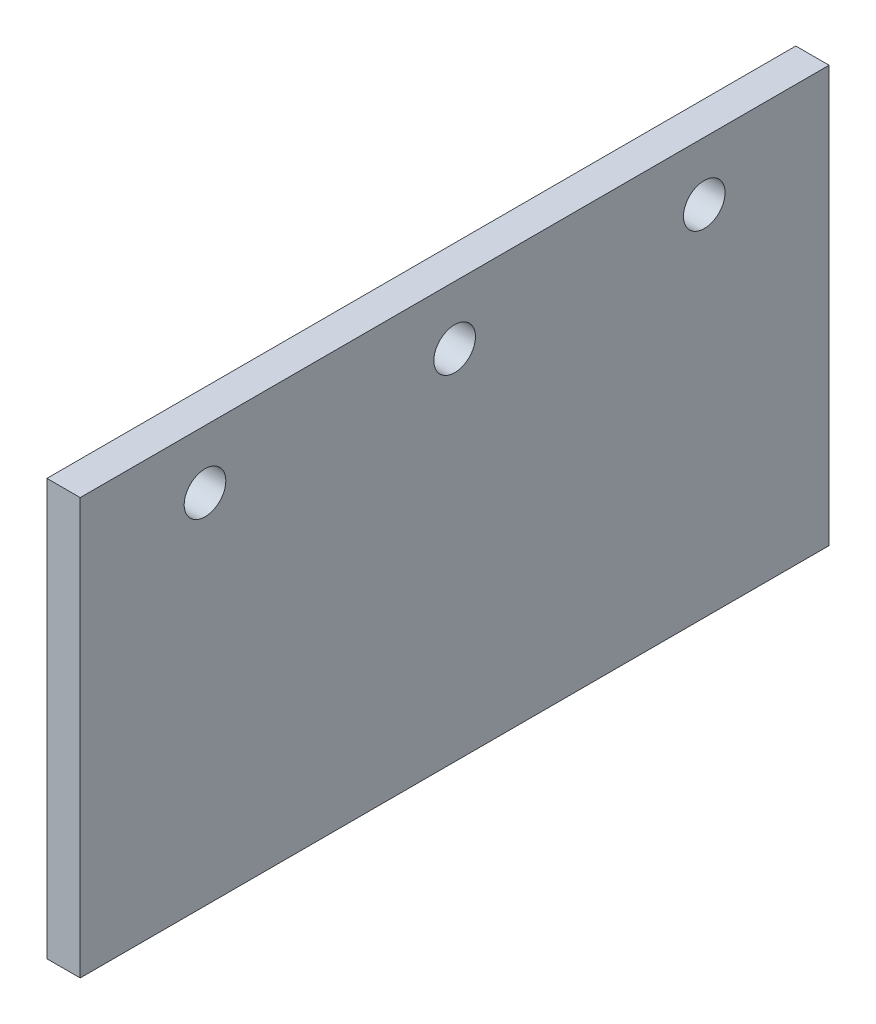
ISO-10303-21;
HEADER;
FILE_DESCRIPTION(('STEP AP214'),'2;1');
FILE_NAME('part.step','',(''),(''),'','','');
FILE_SCHEMA(('AUTOMOTIVE_DESIGN { 1 0 10303 214 1 1 1 1 }'));
ENDSEC;
DATA;
#1=APPLICATION_CONTEXT('core data for automotive mechanical design processes');
#2=APPLICATION_PROTOCOL_DEFINITION('international standard','automotive_design',2000,#1);
#3=PRODUCT_CONTEXT('',#1,'mechanical');
#4=PRODUCT('Part','Part','',(#3));
#5=PRODUCT_RELATED_PRODUCT_CATEGORY('part','',(#4));
#6=PRODUCT_DEFINITION_FORMATION('','',#4);
#7=PRODUCT_DEFINITION_CONTEXT('part definition',#1,'design');
#8=PRODUCT_DEFINITION('design','',#6,#7);
#9=PRODUCT_DEFINITION_SHAPE('','',#8);
#10=(LENGTH_UNIT() NAMED_UNIT(*) SI_UNIT(.MILLI.,.METRE.));
#11=(NAMED_UNIT(*) PLANE_ANGLE_UNIT() SI_UNIT($,.RADIAN.));
#12=(NAMED_UNIT(*) SI_UNIT($,.STERADIAN.) SOLID_ANGLE_UNIT());
#13=UNCERTAINTY_MEASURE_WITH_UNIT(LENGTH_MEASURE(1.E-05),#10,'distance_accuracy_value','');
#14=(GEOMETRIC_REPRESENTATION_CONTEXT(3) GLOBAL_UNCERTAINTY_ASSIGNED_CONTEXT((#13)) GLOBAL_UNIT_ASSIGNED_CONTEXT((#10,
#11,#12)) REPRESENTATION_CONTEXT('',''));
#15=CARTESIAN_POINT('',(0.,0.,0.));
#16=DIRECTION('',(0.,0.,1.));
#17=DIRECTION('',(1.,0.,0.));
#18=AXIS2_PLACEMENT_3D('',#15,#16,#17);
#19=CARTESIAN_POINT('',(4.,0.,0.));
#20=DIRECTION('',(0.,0.,-1.));
#21=DIRECTION('',(0.,1.,0.));
#22=AXIS2_PLACEMENT_3D('',#19,#20,#21);
#23=PLANE('',#22);
#24=DIRECTION('',(0.,-1.,0.));
#25=VECTOR('',#24,1.);
#26=CARTESIAN_POINT('',(0.,0.,0.));
#27=LINE('',#26,#25);
#28=CARTESIAN_POINT('',(0.,0.,0.));
#29=VERTEX_POINT('',#28);
#30=CARTESIAN_POINT('',(0.,-50.,0.));
#31=VERTEX_POINT('',#30);
#32=EDGE_CURVE('E103',#29,#31,#27,.T.);
#33=ORIENTED_EDGE('',*,*,#32,.T.);
#34=DIRECTION('',(-1.,0.,0.));
#35=VECTOR('',#34,1.);
#36=CARTESIAN_POINT('',(4.,-50.,0.));
#37=LINE('',#36,#35);
#38=CARTESIAN_POINT('',(4.,-50.,0.));
#39=VERTEX_POINT('',#38);
#40=EDGE_CURVE('E11',#39,#31,#37,.T.);
#41=ORIENTED_EDGE('',*,*,#40,.F.);
#42=DIRECTION('',(0.,-1.,0.));
#43=VECTOR('',#42,1.);
#44=CARTESIAN_POINT('',(4.,0.,0.));
#45=LINE('',#44,#43);
#46=CARTESIAN_POINT('',(4.,0.,0.));
#47=VERTEX_POINT('',#46);
#48=EDGE_CURVE('E91',#47,#39,#45,.T.);
#49=ORIENTED_EDGE('',*,*,#48,.F.);
#50=DIRECTION('',(-1.,0.,0.));
#51=VECTOR('',#50,1.);
#52=CARTESIAN_POINT('',(4.,0.,0.));
#53=LINE('',#52,#51);
#54=EDGE_CURVE('E99',#47,#29,#53,.T.);
#55=ORIENTED_EDGE('',*,*,#54,.T.);
#56=EDGE_LOOP('',(#33,#41,#49,#55));
#57=FACE_BOUND('',#56,.T.);
#58=ADVANCED_FACE('F40',(#57),#23,.F.);
#59=CARTESIAN_POINT('',(4.,-50.,0.));
#60=DIRECTION('',(0.,1.,0.));
#61=DIRECTION('',(0.,0.,1.));
#62=AXIS2_PLACEMENT_3D('',#59,#60,#61);
#63=PLANE('',#62);
#64=DIRECTION('',(0.,0.,-1.));
#65=VECTOR('',#64,1.);
#66=CARTESIAN_POINT('',(0.,-50.,0.));
#67=LINE('',#66,#65);
#68=CARTESIAN_POINT('',(0.,-50.,-90.));
#69=VERTEX_POINT('',#68);
#70=EDGE_CURVE('E95',#31,#69,#67,.T.);
#71=ORIENTED_EDGE('',*,*,#70,.T.);
#72=DIRECTION('',(-1.,0.,0.));
#73=VECTOR('',#72,1.);
#74=CARTESIAN_POINT('',(4.,-50.,-90.));
#75=LINE('',#74,#73);
#76=CARTESIAN_POINT('',(4.,-50.,-90.));
#77=VERTEX_POINT('',#76);
#78=EDGE_CURVE('E48',#77,#69,#75,.T.);
#79=ORIENTED_EDGE('',*,*,#78,.F.);
#80=DIRECTION('',(0.,0.,-1.));
#81=VECTOR('',#80,1.);
#82=CARTESIAN_POINT('',(4.,-50.,0.));
#83=LINE('',#82,#81);
#84=EDGE_CURVE('E86',#39,#77,#83,.T.);
#85=ORIENTED_EDGE('',*,*,#84,.F.);
#86=ORIENTED_EDGE('',*,*,#40,.T.);
#87=EDGE_LOOP('',(#71,#79,#85,#86));
#88=FACE_BOUND('',#87,.T.);
#89=ADVANCED_FACE('F94',(#88),#63,.F.);
#90=CARTESIAN_POINT('',(4.,0.,-90.));
#91=DIRECTION('',(0.,0.,1.));
#92=DIRECTION('',(1.,0.,0.));
#93=AXIS2_PLACEMENT_3D('',#90,#91,#92);
#94=PLANE('',#93);
#95=DIRECTION('',(0.,1.,0.));
#96=VECTOR('',#95,1.);
#97=CARTESIAN_POINT('',(0.,0.,-90.));
#98=LINE('',#97,#96);
#99=CARTESIAN_POINT('',(0.,0.,-90.));
#100=VERTEX_POINT('',#99);
#101=EDGE_CURVE('E73',#69,#100,#98,.T.);
#102=ORIENTED_EDGE('',*,*,#101,.T.);
#103=DIRECTION('',(-1.,0.,0.));
#104=VECTOR('',#103,1.);
#105=CARTESIAN_POINT('',(4.,0.,-90.));
#106=LINE('',#105,#104);
#107=CARTESIAN_POINT('',(4.,0.,-90.));
#108=VERTEX_POINT('',#107);
#109=EDGE_CURVE('E96',#108,#100,#106,.T.);
#110=ORIENTED_EDGE('',*,*,#109,.F.);
#111=DIRECTION('',(0.,1.,0.));
#112=VECTOR('',#111,1.);
#113=CARTESIAN_POINT('',(4.,0.,-90.));
#114=LINE('',#113,#112);
#115=EDGE_CURVE('E89',#77,#108,#114,.T.);
#116=ORIENTED_EDGE('',*,*,#115,.F.);
#117=ORIENTED_EDGE('',*,*,#78,.T.);
#118=EDGE_LOOP('',(#102,#110,#116,#117));
#119=FACE_BOUND('',#118,.T.);
#120=ADVANCED_FACE('F97',(#119),#94,.F.);
#121=CARTESIAN_POINT('',(4.,0.,0.));
#122=DIRECTION('',(0.,-1.,0.));
#123=DIRECTION('',(0.,0.,-1.));
#124=AXIS2_PLACEMENT_3D('',#121,#122,#123);
#125=PLANE('',#124);
#126=DIRECTION('',(0.,0.,1.));
#127=VECTOR('',#126,1.);
#128=CARTESIAN_POINT('',(0.,0.,0.));
#129=LINE('',#128,#127);
#130=EDGE_CURVE('E79',#100,#29,#129,.T.);
#131=ORIENTED_EDGE('',*,*,#130,.T.);
#132=ORIENTED_EDGE('',*,*,#54,.F.);
#133=DIRECTION('',(0.,0.,1.));
#134=VECTOR('',#133,1.);
#135=CARTESIAN_POINT('',(4.,0.,0.));
#136=LINE('',#135,#134);
#137=EDGE_CURVE('E56',#108,#47,#136,.T.);
#138=ORIENTED_EDGE('',*,*,#137,.F.);
#139=ORIENTED_EDGE('',*,*,#109,.T.);
#140=EDGE_LOOP('',(#131,#132,#138,#139));
#141=FACE_BOUND('',#140,.T.);
#142=ADVANCED_FACE('F111',(#141),#125,.F.);
#143=CARTESIAN_POINT('',(4.,0.,0.));
#144=DIRECTION('',(1.,0.,0.));
#145=DIRECTION('',(0.,0.,-1.));
#146=AXIS2_PLACEMENT_3D('',#143,#144,#145);
#147=PLANE('',#146);
#148=CARTESIAN_POINT('',(4.,-7.,-15.));
#149=DIRECTION('',(1.,0.,0.));
#150=DIRECTION('',(0.,0.,-1.));
#151=AXIS2_PLACEMENT_3D('',#148,#149,#150);
#152=CIRCLE('',#151,2.5);
#153=CARTESIAN_POINT('',(4.,-7.,-17.5));
#154=VERTEX_POINT('',#153);
#155=EDGE_CURVE('E106',#154,#154,#152,.T.);
#156=ORIENTED_EDGE('',*,*,#155,.F.);
#157=EDGE_LOOP('',(#156));
#158=FACE_BOUND('',#157,.T.);
#159=CARTESIAN_POINT('',(4.,-7.,-45.));
#160=DIRECTION('',(1.,0.,0.));
#161=DIRECTION('',(0.,0.,-1.));
#162=AXIS2_PLACEMENT_3D('',#159,#160,#161);
#163=CIRCLE('',#162,2.5);
#164=CARTESIAN_POINT('',(4.,-7.,-47.5));
#165=VERTEX_POINT('',#164);
#166=EDGE_CURVE('E119',#165,#165,#163,.T.);
#167=ORIENTED_EDGE('',*,*,#166,.F.);
#168=EDGE_LOOP('',(#167));
#169=FACE_BOUND('',#168,.T.);
#170=CARTESIAN_POINT('',(4.,-7.,-75.));
#171=DIRECTION('',(1.,0.,0.));
#172=DIRECTION('',(0.,0.,-1.));
#173=AXIS2_PLACEMENT_3D('',#170,#171,#172);
#174=CIRCLE('',#173,2.50000000000001);
#175=CARTESIAN_POINT('',(4.,-7.,-77.5));
#176=VERTEX_POINT('',#175);
#177=EDGE_CURVE('E122',#176,#176,#174,.T.);
#178=ORIENTED_EDGE('',*,*,#177,.F.);
#179=EDGE_LOOP('',(#178));
#180=FACE_BOUND('',#179,.T.);
#181=ORIENTED_EDGE('',*,*,#48,.T.);
#182=ORIENTED_EDGE('',*,*,#84,.T.);
#183=ORIENTED_EDGE('',*,*,#115,.T.);
#184=ORIENTED_EDGE('',*,*,#137,.T.);
#185=EDGE_LOOP('',(#181,#182,#183,#184));
#186=FACE_BOUND('',#185,.T.);
#187=ADVANCED_FACE('F87',(#158,#169,#180,#186),#147,.T.);
#188=CARTESIAN_POINT('',(0.,0.,0.));
#189=DIRECTION('',(1.,0.,0.));
#190=DIRECTION('',(0.,0.,-1.));
#191=AXIS2_PLACEMENT_3D('',#188,#189,#190);
#192=PLANE('',#191);
#193=CARTESIAN_POINT('',(0.,-7.,-15.));
#194=DIRECTION('',(1.,0.,0.));
#195=DIRECTION('',(0.,0.,-1.));
#196=AXIS2_PLACEMENT_3D('',#193,#194,#195);
#197=CIRCLE('',#196,2.5);
#198=CARTESIAN_POINT('',(0.,-7.,-17.5));
#199=VERTEX_POINT('',#198);
#200=EDGE_CURVE('E125',#199,#199,#197,.T.);
#201=ORIENTED_EDGE('',*,*,#200,.T.);
#202=EDGE_LOOP('',(#201));
#203=FACE_BOUND('',#202,.T.);
#204=CARTESIAN_POINT('',(0.,-7.,-45.));
#205=DIRECTION('',(1.,0.,0.));
#206=DIRECTION('',(0.,0.,-1.));
#207=AXIS2_PLACEMENT_3D('',#204,#205,#206);
#208=CIRCLE('',#207,2.5);
#209=CARTESIAN_POINT('',(0.,-7.,-47.5));
#210=VERTEX_POINT('',#209);
#211=EDGE_CURVE('E129',#210,#210,#208,.T.);
#212=ORIENTED_EDGE('',*,*,#211,.T.);
#213=EDGE_LOOP('',(#212));
#214=FACE_BOUND('',#213,.T.);
#215=CARTESIAN_POINT('',(0.,-7.,-75.));
#216=DIRECTION('',(1.,0.,0.));
#217=DIRECTION('',(0.,0.,-1.));
#218=AXIS2_PLACEMENT_3D('',#215,#216,#217);
#219=CIRCLE('',#218,2.50000000000001);
#220=CARTESIAN_POINT('',(0.,-7.,-77.5));
#221=VERTEX_POINT('',#220);
#222=EDGE_CURVE('E126',#221,#221,#219,.T.);
#223=ORIENTED_EDGE('',*,*,#222,.T.);
#224=EDGE_LOOP('',(#223));
#225=FACE_BOUND('',#224,.T.);
#226=ORIENTED_EDGE('',*,*,#32,.F.);
#227=ORIENTED_EDGE('',*,*,#130,.F.);
#228=ORIENTED_EDGE('',*,*,#101,.F.);
#229=ORIENTED_EDGE('',*,*,#70,.F.);
#230=EDGE_LOOP('',(#226,#227,#228,#229));
#231=FACE_BOUND('',#230,.T.);
#232=ADVANCED_FACE('F114',(#203,#214,#225,#231),#192,.F.);
#233=CARTESIAN_POINT('',(0.,-7.,-75.));
#234=DIRECTION('',(1.,0.,0.));
#235=DIRECTION('',(0.,0.,-1.));
#236=AXIS2_PLACEMENT_3D('',#233,#234,#235);
#237=CYLINDRICAL_SURFACE('',#236,2.50000000000001);
#238=ORIENTED_EDGE('',*,*,#177,.T.);
#239=EDGE_LOOP('',(#238));
#240=FACE_BOUND('',#239,.T.);
#241=ORIENTED_EDGE('',*,*,#222,.F.);
#242=EDGE_LOOP('',(#241));
#243=FACE_BOUND('',#242,.T.);
#244=ADVANCED_FACE('F145',(#240,#243),#237,.F.);
#245=CARTESIAN_POINT('',(0.,-7.,-45.));
#246=DIRECTION('',(1.,0.,0.));
#247=DIRECTION('',(0.,0.,-1.));
#248=AXIS2_PLACEMENT_3D('',#245,#246,#247);
#249=CYLINDRICAL_SURFACE('',#248,2.5);
#250=ORIENTED_EDGE('',*,*,#166,.T.);
#251=EDGE_LOOP('',(#250));
#252=FACE_BOUND('',#251,.T.);
#253=ORIENTED_EDGE('',*,*,#211,.F.);
#254=EDGE_LOOP('',(#253));
#255=FACE_BOUND('',#254,.T.);
#256=ADVANCED_FACE('F139',(#252,#255),#249,.F.);
#257=CARTESIAN_POINT('',(0.,-7.,-15.));
#258=DIRECTION('',(1.,0.,0.));
#259=DIRECTION('',(0.,0.,-1.));
#260=AXIS2_PLACEMENT_3D('',#257,#258,#259);
#261=CYLINDRICAL_SURFACE('',#260,2.5);
#262=ORIENTED_EDGE('',*,*,#155,.T.);
#263=EDGE_LOOP('',(#262));
#264=FACE_BOUND('',#263,.T.);
#265=ORIENTED_EDGE('',*,*,#200,.F.);
#266=EDGE_LOOP('',(#265));
#267=FACE_BOUND('',#266,.T.);
#268=ADVANCED_FACE('F137',(#264,#267),#261,.F.);
#269=CLOSED_SHELL('',(#58,#89,#120,#142,#187,#232,#244,#256,#268));
#270=MANIFOLD_SOLID_BREP('B2',#269);
#271=ADVANCED_BREP_SHAPE_REPRESENTATION('',(#18,#270),#14);
#272=SHAPE_DEFINITION_REPRESENTATION(#9,#271);
ENDSEC;
END-ISO-10303-21;
